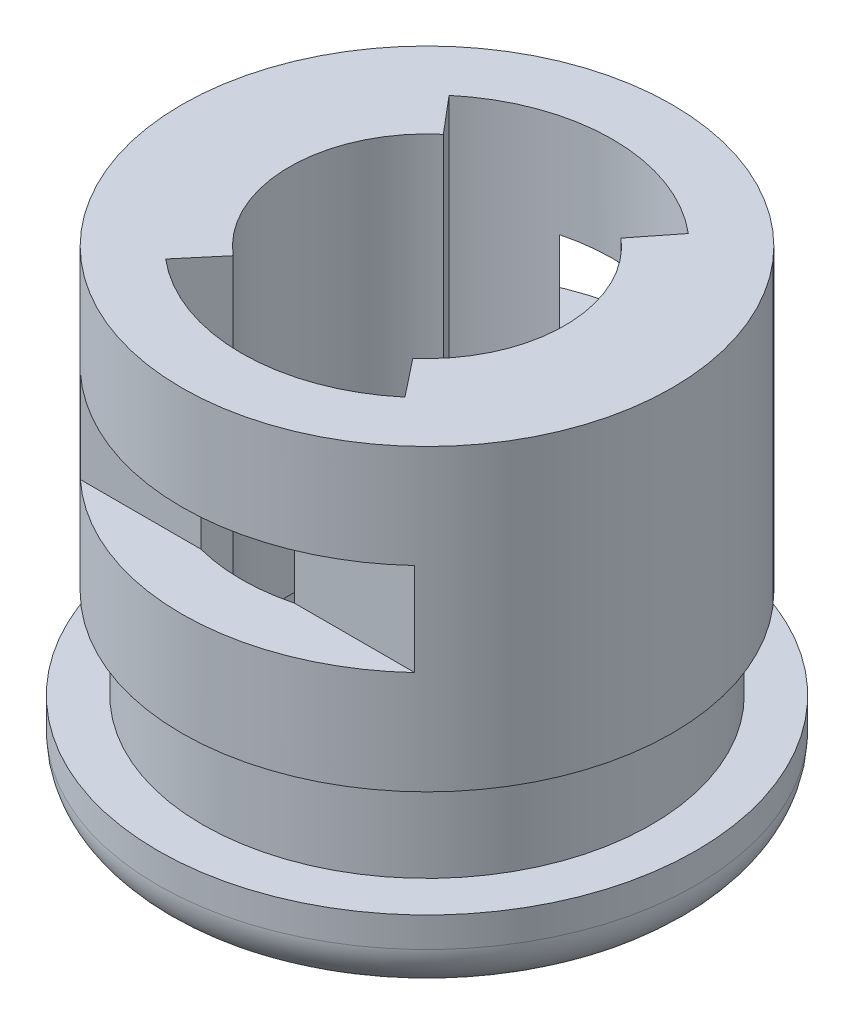
ISO-10303-21;
HEADER;
FILE_DESCRIPTION(('STEP AP214'),'2;1');
FILE_NAME('part.step','',(''),(''),'','','');
FILE_SCHEMA(('AUTOMOTIVE_DESIGN { 1 0 10303 214 1 1 1 1 }'));
ENDSEC;
DATA;
#1=APPLICATION_CONTEXT('core data for automotive mechanical design processes');
#2=APPLICATION_PROTOCOL_DEFINITION('international standard','automotive_design',2000,#1);
#3=PRODUCT_CONTEXT('',#1,'mechanical');
#4=PRODUCT('Part','Part','',(#3));
#5=PRODUCT_RELATED_PRODUCT_CATEGORY('part','',(#4));
#6=PRODUCT_DEFINITION_FORMATION('','',#4);
#7=PRODUCT_DEFINITION_CONTEXT('part definition',#1,'design');
#8=PRODUCT_DEFINITION('design','',#6,#7);
#9=PRODUCT_DEFINITION_SHAPE('','',#8);
#10=(LENGTH_UNIT() NAMED_UNIT(*) SI_UNIT(.MILLI.,.METRE.));
#11=(NAMED_UNIT(*) PLANE_ANGLE_UNIT() SI_UNIT($,.RADIAN.));
#12=(NAMED_UNIT(*) SI_UNIT($,.STERADIAN.) SOLID_ANGLE_UNIT());
#13=UNCERTAINTY_MEASURE_WITH_UNIT(LENGTH_MEASURE(1.E-05),#10,'distance_accuracy_value','');
#14=(GEOMETRIC_REPRESENTATION_CONTEXT(3) GLOBAL_UNCERTAINTY_ASSIGNED_CONTEXT((#13)) GLOBAL_UNIT_ASSIGNED_CONTEXT((#10,
#11,#12)) REPRESENTATION_CONTEXT('',''));
#15=CARTESIAN_POINT('',(0.,0.,0.));
#16=DIRECTION('',(0.,0.,1.));
#17=DIRECTION('',(1.,0.,0.));
#18=AXIS2_PLACEMENT_3D('',#15,#16,#17);
#19=CARTESIAN_POINT('',(0.,1.6,0.));
#20=DIRECTION('',(0.,1.,0.));
#21=DIRECTION('',(0.,0.,1.));
#22=AXIS2_PLACEMENT_3D('',#19,#20,#21);
#23=PLANE('',#22);
#24=CARTESIAN_POINT('',(0.,1.6,0.));
#25=DIRECTION('',(0.,1.,0.));
#26=DIRECTION('',(0.,0.,1.));
#27=AXIS2_PLACEMENT_3D('',#24,#25,#26);
#28=CIRCLE('',#27,2.3);
#29=CARTESIAN_POINT('',(1.64240677056568,1.6,1.61012421881046));
#30=VERTEX_POINT('',#29);
#31=CARTESIAN_POINT('',(1.64240677056568,1.6,-1.61012421881046));
#32=VERTEX_POINT('',#31);
#33=EDGE_CURVE('E452',#30,#32,#28,.T.);
#34=ORIENTED_EDGE('',*,*,#33,.T.);
#35=DIRECTION('',(0.,0.,1.));
#36=VECTOR('',#35,1.);
#37=CARTESIAN_POINT('',(1.64240677056568,1.6,-1.75));
#38=LINE('',#37,#36);
#39=EDGE_CURVE('E339',#32,#30,#38,.T.);
#40=ORIENTED_EDGE('',*,*,#39,.T.);
#41=EDGE_LOOP('',(#34,#40));
#42=FACE_BOUND('',#41,.T.);
#43=ADVANCED_FACE('F39',(#42),#23,.T.);
#44=CARTESIAN_POINT('',(0.,1.6,0.));
#45=DIRECTION('',(0.,1.,0.));
#46=DIRECTION('',(0.,0.,1.));
#47=AXIS2_PLACEMENT_3D('',#44,#45,#46);
#48=CIRCLE('',#47,2.4);
#49=CARTESIAN_POINT('',(1.56571861908372,1.6,-1.81893518462165));
#50=VERTEX_POINT('',#49);
#51=CARTESIAN_POINT('',(0.6,1.6,-2.32379000772445));
#52=VERTEX_POINT('',#51);
#53=EDGE_CURVE('E380',#50,#52,#48,.T.);
#54=ORIENTED_EDGE('',*,*,#53,.F.);
#55=DIRECTION('',(0.619978248543208,0.,-0.784618997560788));
#56=VECTOR('',#55,1.);
#57=CARTESIAN_POINT('',(2.,1.6,-2.3685438564654));
#58=LINE('',#57,#56);
#59=CARTESIAN_POINT('',(2.,1.6,-2.3685438564654));
#60=VERTEX_POINT('',#59);
#61=EDGE_CURVE('E451',#50,#60,#58,.T.);
#62=ORIENTED_EDGE('',*,*,#61,.T.);
#63=CARTESIAN_POINT('',(0.,1.6,0.));
#64=DIRECTION('',(0.,1.,0.));
#65=DIRECTION('',(0.,0.,1.));
#66=AXIS2_PLACEMENT_3D('',#63,#64,#65);
#67=CIRCLE('',#66,3.1);
#68=CARTESIAN_POINT('',(0.6,1.6,-3.04138126514911));
#69=VERTEX_POINT('',#68);
#70=EDGE_CURVE('E418',#60,#69,#67,.T.);
#71=ORIENTED_EDGE('',*,*,#70,.T.);
#72=DIRECTION('',(0.,0.,-1.));
#73=VECTOR('',#72,1.);
#74=CARTESIAN_POINT('',(0.6,1.6,-2.32379000772445));
#75=LINE('',#74,#73);
#76=EDGE_CURVE('E376',#52,#69,#75,.T.);
#77=ORIENTED_EDGE('',*,*,#76,.F.);
#78=EDGE_LOOP('',(#54,#62,#71,#77));
#79=FACE_BOUND('',#78,.T.);
#80=ADVANCED_FACE('F606',(#79),#23,.T.);
#81=DIRECTION('',(0.,0.,1.));
#82=VECTOR('',#81,1.);
#83=CARTESIAN_POINT('',(-0.6,1.6,-3.1));
#84=LINE('',#83,#82);
#85=CARTESIAN_POINT('',(-0.6,1.6,-3.04138126514911));
#86=VERTEX_POINT('',#85);
#87=CARTESIAN_POINT('',(-0.599999999999998,1.6,-2.32379000772445));
#88=VERTEX_POINT('',#87);
#89=EDGE_CURVE('E364',#86,#88,#84,.T.);
#90=ORIENTED_EDGE('',*,*,#89,.F.);
#91=CARTESIAN_POINT('',(-2.,1.6,-2.3685438564654));
#92=VERTEX_POINT('',#91);
#93=EDGE_CURVE('E424',#86,#92,#67,.T.);
#94=ORIENTED_EDGE('',*,*,#93,.T.);
#95=DIRECTION('',(0.645161290322581,0.,0.76404640531142));
#96=VECTOR('',#95,1.);
#97=CARTESIAN_POINT('',(-2.,1.6,-2.3685438564654));
#98=LINE('',#97,#96);
#99=CARTESIAN_POINT('',(-1.54838709677419,1.6,-1.83371137274741));
#100=VERTEX_POINT('',#99);
#101=EDGE_CURVE('E425',#92,#100,#98,.T.);
#102=ORIENTED_EDGE('',*,*,#101,.T.);
#103=CARTESIAN_POINT('',(0.,1.6,0.));
#104=DIRECTION('',(0.,1.,0.));
#105=DIRECTION('',(0.,0.,1.));
#106=AXIS2_PLACEMENT_3D('',#103,#104,#105);
#107=CIRCLE('',#106,2.4);
#108=EDGE_CURVE('E360',#88,#100,#107,.T.);
#109=ORIENTED_EDGE('',*,*,#108,.F.);
#110=EDGE_LOOP('',(#90,#94,#102,#109));
#111=FACE_BOUND('',#110,.T.);
#112=ADVANCED_FACE('F613',(#111),#23,.T.);
#113=CARTESIAN_POINT('',(-1.54838709677419,1.6,1.83371137274741));
#114=VERTEX_POINT('',#113);
#115=CARTESIAN_POINT('',(-0.599999999999999,1.6,2.32379000772445));
#116=VERTEX_POINT('',#115);
#117=EDGE_CURVE('E359',#114,#116,#107,.T.);
#118=ORIENTED_EDGE('',*,*,#117,.F.);
#119=DIRECTION('',(-0.645161290322581,0.,0.76404640531142));
#120=VECTOR('',#119,1.);
#121=CARTESIAN_POINT('',(-2.,1.6,2.3685438564654));
#122=LINE('',#121,#120);
#123=CARTESIAN_POINT('',(-2.,1.6,2.3685438564654));
#124=VERTEX_POINT('',#123);
#125=EDGE_CURVE('E432',#114,#124,#122,.T.);
#126=ORIENTED_EDGE('',*,*,#125,.T.);
#127=CARTESIAN_POINT('',(0.,1.6,0.));
#128=DIRECTION('',(0.,1.,0.));
#129=DIRECTION('',(0.,0.,1.));
#130=AXIS2_PLACEMENT_3D('',#127,#128,#129);
#131=CIRCLE('',#130,3.1);
#132=CARTESIAN_POINT('',(-0.599999999999998,1.6,3.04138126514911));
#133=VERTEX_POINT('',#132);
#134=EDGE_CURVE('E437',#124,#133,#131,.T.);
#135=ORIENTED_EDGE('',*,*,#134,.T.);
#136=DIRECTION('',(0.,0.,1.));
#137=VECTOR('',#136,1.);
#138=CARTESIAN_POINT('',(-0.599999999999998,1.6,2.32379000772445));
#139=LINE('',#138,#137);
#140=EDGE_CURVE('E355',#116,#133,#139,.T.);
#141=ORIENTED_EDGE('',*,*,#140,.F.);
#142=EDGE_LOOP('',(#118,#126,#135,#141));
#143=FACE_BOUND('',#142,.T.);
#144=ADVANCED_FACE('F622',(#143),#23,.T.);
#145=CARTESIAN_POINT('',(0.,0.,0.));
#146=DIRECTION('',(0.,1.,0.));
#147=DIRECTION('',(0.,0.,1.));
#148=AXIS2_PLACEMENT_3D('',#145,#146,#147);
#149=PLANE('',#148);
#150=CARTESIAN_POINT('',(0.,0.,0.));
#151=DIRECTION('',(0.,1.,0.));
#152=DIRECTION('',(0.,0.,1.));
#153=AXIS2_PLACEMENT_3D('',#150,#151,#152);
#154=CIRCLE('',#153,3.7);
#155=CARTESIAN_POINT('',(0.,0.,3.7));
#156=VERTEX_POINT('',#155);
#157=EDGE_CURVE('E263',#156,#156,#154,.F.);
#158=ORIENTED_EDGE('',*,*,#157,.T.);
#159=EDGE_LOOP('',(#158));
#160=FACE_BOUND('',#159,.T.);
#161=DIRECTION('',(0.,0.,1.));
#162=VECTOR('',#161,1.);
#163=CARTESIAN_POINT('',(1.64240677056568,0.,0.));
#164=LINE('',#163,#162);
#165=CARTESIAN_POINT('',(1.64240677056568,0.,-1.75));
#166=VERTEX_POINT('',#165);
#167=CARTESIAN_POINT('',(1.64240677056568,0.,1.75));
#168=VERTEX_POINT('',#167);
#169=EDGE_CURVE('E567',#166,#168,#164,.T.);
#170=ORIENTED_EDGE('',*,*,#169,.F.);
#171=CARTESIAN_POINT('',(0.,0.,0.));
#172=DIRECTION('',(0.,1.,0.));
#173=DIRECTION('',(0.,0.,1.));
#174=AXIS2_PLACEMENT_3D('',#171,#172,#173);
#175=CIRCLE('',#174,2.4);
#176=CARTESIAN_POINT('',(0.6,0.,-2.32379000772445));
#177=VERTEX_POINT('',#176);
#178=EDGE_CURVE('E528',#166,#177,#175,.T.);
#179=ORIENTED_EDGE('',*,*,#178,.T.);
#180=DIRECTION('',(0.,0.,-1.));
#181=VECTOR('',#180,1.);
#182=CARTESIAN_POINT('',(0.6,0.,0.));
#183=LINE('',#182,#181);
#184=CARTESIAN_POINT('',(0.6,0.,-3.1));
#185=VERTEX_POINT('',#184);
#186=EDGE_CURVE('E535',#177,#185,#183,.T.);
#187=ORIENTED_EDGE('',*,*,#186,.T.);
#188=DIRECTION('',(-1.,0.,0.));
#189=VECTOR('',#188,1.);
#190=CARTESIAN_POINT('',(0.,0.,-3.1));
#191=LINE('',#190,#189);
#192=CARTESIAN_POINT('',(-0.6,0.,-3.1));
#193=VERTEX_POINT('',#192);
#194=EDGE_CURVE('E539',#185,#193,#191,.T.);
#195=ORIENTED_EDGE('',*,*,#194,.T.);
#196=DIRECTION('',(0.,0.,1.));
#197=VECTOR('',#196,1.);
#198=CARTESIAN_POINT('',(-0.599999999999994,0.,0.));
#199=LINE('',#198,#197);
#200=CARTESIAN_POINT('',(-0.599999999999998,0.,-2.32379000772445));
#201=VERTEX_POINT('',#200);
#202=EDGE_CURVE('E543',#193,#201,#199,.T.);
#203=ORIENTED_EDGE('',*,*,#202,.T.);
#204=CARTESIAN_POINT('',(0.,0.,0.));
#205=DIRECTION('',(0.,1.,0.));
#206=DIRECTION('',(0.,0.,1.));
#207=AXIS2_PLACEMENT_3D('',#204,#205,#206);
#208=CIRCLE('',#207,2.4);
#209=CARTESIAN_POINT('',(-0.599999999999999,0.,2.32379000772445));
#210=VERTEX_POINT('',#209);
#211=EDGE_CURVE('E547',#201,#210,#208,.T.);
#212=ORIENTED_EDGE('',*,*,#211,.T.);
#213=DIRECTION('',(0.,0.,1.));
#214=VECTOR('',#213,1.);
#215=CARTESIAN_POINT('',(-0.6,0.,0.));
#216=LINE('',#215,#214);
#217=CARTESIAN_POINT('',(-0.599999999999998,0.,3.1));
#218=VERTEX_POINT('',#217);
#219=EDGE_CURVE('E551',#210,#218,#216,.T.);
#220=ORIENTED_EDGE('',*,*,#219,.T.);
#221=DIRECTION('',(1.,0.,0.));
#222=VECTOR('',#221,1.);
#223=CARTESIAN_POINT('',(0.,0.,3.1));
#224=LINE('',#223,#222);
#225=CARTESIAN_POINT('',(0.6,0.,3.1));
#226=VERTEX_POINT('',#225);
#227=EDGE_CURVE('E555',#218,#226,#224,.T.);
#228=ORIENTED_EDGE('',*,*,#227,.T.);
#229=DIRECTION('',(0.,0.,-1.));
#230=VECTOR('',#229,1.);
#231=CARTESIAN_POINT('',(0.6,0.,0.));
#232=LINE('',#231,#230);
#233=CARTESIAN_POINT('',(0.6,0.,2.32379000772445));
#234=VERTEX_POINT('',#233);
#235=EDGE_CURVE('E559',#226,#234,#232,.T.);
#236=ORIENTED_EDGE('',*,*,#235,.T.);
#237=CARTESIAN_POINT('',(0.,0.,0.));
#238=DIRECTION('',(0.,1.,0.));
#239=DIRECTION('',(0.,0.,1.));
#240=AXIS2_PLACEMENT_3D('',#237,#238,#239);
#241=CIRCLE('',#240,2.4);
#242=EDGE_CURVE('E563',#234,#168,#241,.T.);
#243=ORIENTED_EDGE('',*,*,#242,.T.);
#244=EDGE_LOOP('',(#170,#179,#187,#195,#203,#212,#220,#228,#236,#243));
#245=FACE_BOUND('',#244,.T.);
#246=ADVANCED_FACE('F578',(#160,#245),#149,.F.);
#247=CARTESIAN_POINT('',(0.,1.3,0.));
#248=DIRECTION('',(0.,-1.,0.));
#249=DIRECTION('',(0.,0.,-1.));
#250=AXIS2_PLACEMENT_3D('',#247,#248,#249);
#251=CYLINDRICAL_SURFACE('',#250,4.5);
#252=CARTESIAN_POINT('',(0.,0.8,0.));
#253=DIRECTION('',(0.,1.,0.));
#254=DIRECTION('',(0.,0.,1.));
#255=AXIS2_PLACEMENT_3D('',#252,#253,#254);
#256=CIRCLE('',#255,4.5);
#257=CARTESIAN_POINT('',(0.,0.8,4.5));
#258=VERTEX_POINT('',#257);
#259=EDGE_CURVE('E570',#258,#258,#256,.T.);
#260=ORIENTED_EDGE('',*,*,#259,.T.);
#261=EDGE_LOOP('',(#260));
#262=FACE_BOUND('',#261,.T.);
#263=CARTESIAN_POINT('',(0.,1.3,0.));
#264=DIRECTION('',(0.,1.,0.));
#265=DIRECTION('',(0.,0.,1.));
#266=AXIS2_PLACEMENT_3D('',#263,#264,#265);
#267=CIRCLE('',#266,4.5);
#268=CARTESIAN_POINT('',(0.,1.3,4.5));
#269=VERTEX_POINT('',#268);
#270=EDGE_CURVE('E523',#269,#269,#267,.T.);
#271=ORIENTED_EDGE('',*,*,#270,.F.);
#272=EDGE_LOOP('',(#271));
#273=FACE_BOUND('',#272,.T.);
#274=ADVANCED_FACE('F587',(#262,#273),#251,.T.);
#275=CARTESIAN_POINT('',(0.,1.3,0.));
#276=DIRECTION('',(0.,1.,0.));
#277=DIRECTION('',(0.,0.,1.));
#278=AXIS2_PLACEMENT_3D('',#275,#276,#277);
#279=PLANE('',#278);
#280=CARTESIAN_POINT('',(0.,1.3,0.));
#281=DIRECTION('',(0.,1.,0.));
#282=DIRECTION('',(0.,0.,1.));
#283=AXIS2_PLACEMENT_3D('',#280,#281,#282);
#284=CIRCLE('',#283,3.75);
#285=CARTESIAN_POINT('',(0.,1.3,3.75));
#286=VERTEX_POINT('',#285);
#287=EDGE_CURVE('E524',#286,#286,#284,.T.);
#288=ORIENTED_EDGE('',*,*,#287,.F.);
#289=EDGE_LOOP('',(#288));
#290=FACE_BOUND('',#289,.T.);
#291=ORIENTED_EDGE('',*,*,#270,.T.);
#292=EDGE_LOOP('',(#291));
#293=FACE_BOUND('',#292,.T.);
#294=ADVANCED_FACE('F590',(#290,#293),#279,.T.);
#295=CARTESIAN_POINT('',(0.,2.8,0.));
#296=DIRECTION('',(0.,-1.,0.));
#297=DIRECTION('',(0.,0.,-1.));
#298=AXIS2_PLACEMENT_3D('',#295,#296,#297);
#299=CYLINDRICAL_SURFACE('',#298,3.75);
#300=CARTESIAN_POINT('',(0.,2.8,0.));
#301=DIRECTION('',(0.,1.,0.));
#302=DIRECTION('',(0.,0.,1.));
#303=AXIS2_PLACEMENT_3D('',#300,#301,#302);
#304=CIRCLE('',#303,3.75);
#305=CARTESIAN_POINT('',(0.,2.8,3.75));
#306=VERTEX_POINT('',#305);
#307=EDGE_CURVE('E516',#306,#306,#304,.T.);
#308=ORIENTED_EDGE('',*,*,#307,.F.);
#309=EDGE_LOOP('',(#308));
#310=FACE_BOUND('',#309,.T.);
#311=ORIENTED_EDGE('',*,*,#287,.T.);
#312=EDGE_LOOP('',(#311));
#313=FACE_BOUND('',#312,.T.);
#314=ADVANCED_FACE('F594',(#310,#313),#299,.T.);
#315=CARTESIAN_POINT('',(0.,7.8,0.));
#316=DIRECTION('',(0.,-1.,0.));
#317=DIRECTION('',(0.,0.,-1.));
#318=AXIS2_PLACEMENT_3D('',#315,#316,#317);
#319=CYLINDRICAL_SURFACE('',#318,4.1);
#320=CARTESIAN_POINT('',(0.,6.075,0.));
#321=DIRECTION('',(0.,1.,0.));
#322=DIRECTION('',(0.,0.,1.));
#323=AXIS2_PLACEMENT_3D('',#320,#321,#322);
#324=CIRCLE('',#323,4.1);
#325=CARTESIAN_POINT('',(-2.79463772249642,6.075,3.));
#326=VERTEX_POINT('',#325);
#327=CARTESIAN_POINT('',(2.79463772249642,6.075,3.));
#328=VERTEX_POINT('',#327);
#329=EDGE_CURVE('E318',#326,#328,#324,.T.);
#330=ORIENTED_EDGE('',*,*,#329,.T.);
#331=DIRECTION('',(0.,-1.,0.));
#332=VECTOR('',#331,1.);
#333=CARTESIAN_POINT('',(2.79463772249642,7.8,3.));
#334=LINE('',#333,#332);
#335=CARTESIAN_POINT('',(2.79463772249643,4.525,3.));
#336=VERTEX_POINT('',#335);
#337=EDGE_CURVE('E315',#328,#336,#334,.T.);
#338=ORIENTED_EDGE('',*,*,#337,.T.);
#339=CARTESIAN_POINT('',(0.,4.525,0.));
#340=DIRECTION('',(0.,-1.,0.));
#341=DIRECTION('',(0.,0.,-1.));
#342=AXIS2_PLACEMENT_3D('',#339,#340,#341);
#343=CIRCLE('',#342,4.1);
#344=CARTESIAN_POINT('',(-2.79463772249643,4.525,3.));
#345=VERTEX_POINT('',#344);
#346=EDGE_CURVE('E55',#336,#345,#343,.T.);
#347=ORIENTED_EDGE('',*,*,#346,.T.);
#348=DIRECTION('',(0.,-1.,0.));
#349=VECTOR('',#348,1.);
#350=CARTESIAN_POINT('',(-2.79463772249642,7.8,3.));
#351=LINE('',#350,#349);
#352=EDGE_CURVE('E270',#345,#326,#351,.F.);
#353=ORIENTED_EDGE('',*,*,#352,.T.);
#354=EDGE_LOOP('',(#330,#338,#347,#353));
#355=FACE_BOUND('',#354,.T.);
#356=DIRECTION('',(0.,-1.,0.));
#357=VECTOR('',#356,1.);
#358=CARTESIAN_POINT('',(-2.79463772249643,7.8,-3.));
#359=LINE('',#358,#357);
#360=CARTESIAN_POINT('',(-2.79463772249643,6.075,-3.));
#361=VERTEX_POINT('',#360);
#362=CARTESIAN_POINT('',(-2.79463772249643,4.525,-3.));
#363=VERTEX_POINT('',#362);
#364=EDGE_CURVE('E324',#361,#363,#359,.T.);
#365=ORIENTED_EDGE('',*,*,#364,.T.);
#366=CARTESIAN_POINT('',(0.,4.525,0.));
#367=DIRECTION('',(0.,-1.,0.));
#368=DIRECTION('',(0.,0.,-1.));
#369=AXIS2_PLACEMENT_3D('',#366,#367,#368);
#370=CIRCLE('',#369,4.1);
#371=CARTESIAN_POINT('',(2.79463772249643,4.525,-3.));
#372=VERTEX_POINT('',#371);
#373=EDGE_CURVE('E328',#363,#372,#370,.T.);
#374=ORIENTED_EDGE('',*,*,#373,.T.);
#375=DIRECTION('',(0.,-1.,0.));
#376=VECTOR('',#375,1.);
#377=CARTESIAN_POINT('',(2.79463772249643,7.8,-3.));
#378=LINE('',#377,#376);
#379=CARTESIAN_POINT('',(2.79463772249643,6.075,-3.));
#380=VERTEX_POINT('',#379);
#381=EDGE_CURVE('E321',#372,#380,#378,.F.);
#382=ORIENTED_EDGE('',*,*,#381,.T.);
#383=CARTESIAN_POINT('',(0.,6.07500000000001,0.));
#384=DIRECTION('',(0.,1.,0.));
#385=DIRECTION('',(0.,0.,1.));
#386=AXIS2_PLACEMENT_3D('',#383,#384,#385);
#387=CIRCLE('',#386,4.1);
#388=EDGE_CURVE('E302',#380,#361,#387,.T.);
#389=ORIENTED_EDGE('',*,*,#388,.T.);
#390=EDGE_LOOP('',(#365,#374,#382,#389));
#391=FACE_BOUND('',#390,.T.);
#392=CARTESIAN_POINT('',(0.,7.8,0.));
#393=DIRECTION('',(0.,1.,0.));
#394=DIRECTION('',(0.,0.,1.));
#395=AXIS2_PLACEMENT_3D('',#392,#393,#394);
#396=CIRCLE('',#395,4.1);
#397=CARTESIAN_POINT('',(0.,7.8,4.1));
#398=VERTEX_POINT('',#397);
#399=EDGE_CURVE('E512',#398,#398,#396,.T.);
#400=ORIENTED_EDGE('',*,*,#399,.F.);
#401=EDGE_LOOP('',(#400));
#402=FACE_BOUND('',#401,.T.);
#403=CARTESIAN_POINT('',(0.,2.8,0.));
#404=DIRECTION('',(0.,1.,0.));
#405=DIRECTION('',(0.,0.,1.));
#406=AXIS2_PLACEMENT_3D('',#403,#404,#405);
#407=CIRCLE('',#406,4.1);
#408=CARTESIAN_POINT('',(0.,2.8,4.1));
#409=VERTEX_POINT('',#408);
#410=EDGE_CURVE('E490',#409,#409,#407,.T.);
#411=ORIENTED_EDGE('',*,*,#410,.T.);
#412=EDGE_LOOP('',(#411));
#413=FACE_BOUND('',#412,.T.);
#414=ADVANCED_FACE('F600',(#355,#391,#402,#413),#319,.T.);
#415=CARTESIAN_POINT('',(0.,7.8,0.));
#416=DIRECTION('',(0.,1.,0.));
#417=DIRECTION('',(0.,0.,1.));
#418=AXIS2_PLACEMENT_3D('',#415,#416,#417);
#419=PLANE('',#418);
#420=CARTESIAN_POINT('',(0.,7.8,0.));
#421=DIRECTION('',(0.,1.,0.));
#422=DIRECTION('',(0.,0.,1.));
#423=AXIS2_PLACEMENT_3D('',#420,#421,#422);
#424=CIRCLE('',#423,3.1);
#425=CARTESIAN_POINT('',(2.,7.8,-2.3685438564654));
#426=VERTEX_POINT('',#425);
#427=CARTESIAN_POINT('',(-2.,7.8,-2.3685438564654));
#428=VERTEX_POINT('',#427);
#429=EDGE_CURVE('E417',#426,#428,#424,.T.);
#430=ORIENTED_EDGE('',*,*,#429,.F.);
#431=DIRECTION('',(0.619978248543208,0.,-0.784618997560788));
#432=VECTOR('',#431,1.);
#433=CARTESIAN_POINT('',(2.,7.8,-2.3685438564654));
#434=LINE('',#433,#432);
#435=CARTESIAN_POINT('',(1.50366366443997,7.8,-1.74040098375143));
#436=VERTEX_POINT('',#435);
#437=EDGE_CURVE('E483',#436,#426,#434,.T.);
#438=ORIENTED_EDGE('',*,*,#437,.F.);
#439=CARTESIAN_POINT('',(0.,7.8,0.));
#440=DIRECTION('',(0.,1.,0.));
#441=DIRECTION('',(0.,0.,1.));
#442=AXIS2_PLACEMENT_3D('',#439,#440,#441);
#443=CIRCLE('',#442,2.3);
#444=CARTESIAN_POINT('',(1.50366366443997,7.8,1.74040098375143));
#445=VERTEX_POINT('',#444);
#446=EDGE_CURVE('E479',#445,#436,#443,.T.);
#447=ORIENTED_EDGE('',*,*,#446,.F.);
#448=DIRECTION('',(-0.619978248543208,0.,-0.784618997560788));
#449=VECTOR('',#448,1.);
#450=CARTESIAN_POINT('',(2.,7.8,2.3685438564654));
#451=LINE('',#450,#449);
#452=CARTESIAN_POINT('',(2.,7.8,2.3685438564654));
#453=VERTEX_POINT('',#452);
#454=EDGE_CURVE('E475',#453,#445,#451,.T.);
#455=ORIENTED_EDGE('',*,*,#454,.F.);
#456=CARTESIAN_POINT('',(0.,7.8,0.));
#457=DIRECTION('',(0.,1.,0.));
#458=DIRECTION('',(0.,0.,1.));
#459=AXIS2_PLACEMENT_3D('',#456,#457,#458);
#460=CIRCLE('',#459,3.1);
#461=CARTESIAN_POINT('',(-2.,7.8,2.3685438564654));
#462=VERTEX_POINT('',#461);
#463=EDGE_CURVE('E471',#462,#453,#460,.T.);
#464=ORIENTED_EDGE('',*,*,#463,.F.);
#465=DIRECTION('',(-0.645161290322581,0.,0.76404640531142));
#466=VECTOR('',#465,1.);
#467=CARTESIAN_POINT('',(-2.,7.8,2.3685438564654));
#468=LINE('',#467,#466);
#469=CARTESIAN_POINT('',(-1.48387096774194,7.8,1.75730673221627));
#470=VERTEX_POINT('',#469);
#471=EDGE_CURVE('E467',#470,#462,#468,.T.);
#472=ORIENTED_EDGE('',*,*,#471,.F.);
#473=CARTESIAN_POINT('',(0.,7.8,0.));
#474=DIRECTION('',(0.,1.,0.));
#475=DIRECTION('',(0.,0.,1.));
#476=AXIS2_PLACEMENT_3D('',#473,#474,#475);
#477=CIRCLE('',#476,2.3);
#478=CARTESIAN_POINT('',(-1.48387096774193,7.8,-1.75730673221627));
#479=VERTEX_POINT('',#478);
#480=EDGE_CURVE('E463',#479,#470,#477,.T.);
#481=ORIENTED_EDGE('',*,*,#480,.F.);
#482=DIRECTION('',(0.645161290322581,0.,0.76404640531142));
#483=VECTOR('',#482,1.);
#484=CARTESIAN_POINT('',(-2.,7.8,-2.3685438564654));
#485=LINE('',#484,#483);
#486=EDGE_CURVE('E459',#428,#479,#485,.T.);
#487=ORIENTED_EDGE('',*,*,#486,.F.);
#488=EDGE_LOOP('',(#430,#438,#447,#455,#464,#472,#481,#487));
#489=FACE_BOUND('',#488,.T.);
#490=ORIENTED_EDGE('',*,*,#399,.T.);
#491=EDGE_LOOP('',(#490));
#492=FACE_BOUND('',#491,.T.);
#493=ADVANCED_FACE('F786',(#489,#492),#419,.T.);
#494=CARTESIAN_POINT('',(0.,2.8,0.));
#495=DIRECTION('',(0.,1.,0.));
#496=DIRECTION('',(0.,0.,1.));
#497=AXIS2_PLACEMENT_3D('',#494,#495,#496);
#498=PLANE('',#497);
#499=ORIENTED_EDGE('',*,*,#307,.T.);
#500=EDGE_LOOP('',(#499));
#501=FACE_BOUND('',#500,.T.);
#502=ORIENTED_EDGE('',*,*,#410,.F.);
#503=EDGE_LOOP('',(#502));
#504=FACE_BOUND('',#503,.T.);
#505=ADVANCED_FACE('F844',(#501,#504),#498,.F.);
#506=CARTESIAN_POINT('',(0.,1.6,0.));
#507=DIRECTION('',(0.,1.,0.));
#508=DIRECTION('',(0.,0.,1.));
#509=AXIS2_PLACEMENT_3D('',#506,#507,#508);
#510=CYLINDRICAL_SURFACE('',#509,3.1);
#511=CARTESIAN_POINT('',(0.,6.07500000000001,0.));
#512=DIRECTION('',(0.,1.,0.));
#513=DIRECTION('',(0.,0.,1.));
#514=AXIS2_PLACEMENT_3D('',#511,#512,#513);
#515=CIRCLE('',#514,3.1);
#516=CARTESIAN_POINT('',(-0.781024967590664,6.075,-3.));
#517=VERTEX_POINT('',#516);
#518=CARTESIAN_POINT('',(0.781024967590664,6.075,-3.));
#519=VERTEX_POINT('',#518);
#520=EDGE_CURVE('E48',#517,#519,#515,.F.);
#521=ORIENTED_EDGE('',*,*,#520,.T.);
#522=DIRECTION('',(0.,1.,0.));
#523=VECTOR('',#522,1.);
#524=CARTESIAN_POINT('',(0.781024967590664,1.6,-3.));
#525=LINE('',#524,#523);
#526=CARTESIAN_POINT('',(0.781024967590664,4.525,-3.));
#527=VERTEX_POINT('',#526);
#528=EDGE_CURVE('E11',#519,#527,#525,.F.);
#529=ORIENTED_EDGE('',*,*,#528,.T.);
#530=CARTESIAN_POINT('',(0.,4.525,0.));
#531=DIRECTION('',(0.,-1.,0.));
#532=DIRECTION('',(0.,0.,-1.));
#533=AXIS2_PLACEMENT_3D('',#530,#531,#532);
#534=CIRCLE('',#533,3.1);
#535=CARTESIAN_POINT('',(-0.781024967590664,4.525,-3.));
#536=VERTEX_POINT('',#535);
#537=EDGE_CURVE('E289',#527,#536,#534,.F.);
#538=ORIENTED_EDGE('',*,*,#537,.T.);
#539=DIRECTION('',(0.,1.,0.));
#540=VECTOR('',#539,1.);
#541=CARTESIAN_POINT('',(-0.781024967590664,1.6,-3.));
#542=LINE('',#541,#540);
#543=EDGE_CURVE('E282',#536,#517,#542,.T.);
#544=ORIENTED_EDGE('',*,*,#543,.T.);
#545=EDGE_LOOP('',(#521,#529,#538,#544));
#546=FACE_BOUND('',#545,.T.);
#547=ORIENTED_EDGE('',*,*,#429,.T.);
#548=DIRECTION('',(0.,1.,0.));
#549=VECTOR('',#548,1.);
#550=CARTESIAN_POINT('',(-2.,1.6,-2.3685438564654));
#551=LINE('',#550,#549);
#552=EDGE_CURVE('E456',#92,#428,#551,.T.);
#553=ORIENTED_EDGE('',*,*,#552,.F.);
#554=ORIENTED_EDGE('',*,*,#93,.F.);
#555=CARTESIAN_POINT('',(0.,1.6,-3.1));
#556=VERTEX_POINT('',#555);
#557=EDGE_CURVE('E659',#556,#86,#67,.T.);
#558=ORIENTED_EDGE('',*,*,#557,.F.);
#559=EDGE_CURVE('E423',#69,#556,#67,.T.);
#560=ORIENTED_EDGE('',*,*,#559,.F.);
#561=ORIENTED_EDGE('',*,*,#70,.F.);
#562=DIRECTION('',(0.,1.,0.));
#563=VECTOR('',#562,1.);
#564=CARTESIAN_POINT('',(2.,1.6,-2.3685438564654));
#565=LINE('',#564,#563);
#566=EDGE_CURVE('E487',#60,#426,#565,.T.);
#567=ORIENTED_EDGE('',*,*,#566,.T.);
#568=EDGE_LOOP('',(#547,#553,#554,#558,#560,#561,#567));
#569=FACE_BOUND('',#568,.T.);
#570=ADVANCED_FACE('F296',(#546,#569),#510,.F.);
#571=CARTESIAN_POINT('',(2.,1.6,-2.3685438564654));
#572=DIRECTION('',(0.784618997560788,0.,0.619978248543208));
#573=DIRECTION('',(0.619978248543208,0.,-0.784618997560788));
#574=AXIS2_PLACEMENT_3D('',#571,#572,#573);
#575=PLANE('',#574);
#576=ORIENTED_EDGE('',*,*,#437,.T.);
#577=ORIENTED_EDGE('',*,*,#566,.F.);
#578=ORIENTED_EDGE('',*,*,#61,.F.);
#579=CARTESIAN_POINT('',(1.50366366443997,1.6,-1.74040098375143));
#580=VERTEX_POINT('',#579);
#581=EDGE_CURVE('E453',#580,#50,#58,.T.);
#582=ORIENTED_EDGE('',*,*,#581,.F.);
#583=DIRECTION('',(0.,1.,0.));
#584=VECTOR('',#583,1.);
#585=CARTESIAN_POINT('',(1.50366366443997,1.6,-1.74040098375143));
#586=LINE('',#585,#584);
#587=EDGE_CURVE('E491',#580,#436,#586,.T.);
#588=ORIENTED_EDGE('',*,*,#587,.T.);
#589=EDGE_LOOP('',(#576,#577,#578,#582,#588));
#590=FACE_BOUND('',#589,.T.);
#591=ADVANCED_FACE('F806',(#590),#575,.F.);
#592=CARTESIAN_POINT('',(0.,1.6,0.));
#593=DIRECTION('',(0.,1.,0.));
#594=DIRECTION('',(0.,0.,1.));
#595=AXIS2_PLACEMENT_3D('',#592,#593,#594);
#596=CYLINDRICAL_SURFACE('',#595,2.3);
#597=ORIENTED_EDGE('',*,*,#446,.T.);
#598=ORIENTED_EDGE('',*,*,#587,.F.);
#599=EDGE_CURVE('E447',#32,#580,#28,.T.);
#600=ORIENTED_EDGE('',*,*,#599,.F.);
#601=ORIENTED_EDGE('',*,*,#33,.F.);
#602=CARTESIAN_POINT('',(1.50366366443997,1.6,1.74040098375143));
#603=VERTEX_POINT('',#602);
#604=EDGE_CURVE('E448',#603,#30,#28,.T.);
#605=ORIENTED_EDGE('',*,*,#604,.F.);
#606=DIRECTION('',(0.,1.,0.));
#607=VECTOR('',#606,1.);
#608=CARTESIAN_POINT('',(1.50366366443997,1.6,1.74040098375143));
#609=LINE('',#608,#607);
#610=EDGE_CURVE('E494',#603,#445,#609,.T.);
#611=ORIENTED_EDGE('',*,*,#610,.T.);
#612=EDGE_LOOP('',(#597,#598,#600,#601,#605,#611));
#613=FACE_BOUND('',#612,.T.);
#614=ADVANCED_FACE('F821',(#613),#596,.F.);
#615=CARTESIAN_POINT('',(2.,1.6,2.3685438564654));
#616=DIRECTION('',(0.784618997560788,0.,-0.619978248543208));
#617=DIRECTION('',(-0.619978248543208,0.,-0.784618997560788));
#618=AXIS2_PLACEMENT_3D('',#615,#616,#617);
#619=PLANE('',#618);
#620=ORIENTED_EDGE('',*,*,#454,.T.);
#621=ORIENTED_EDGE('',*,*,#610,.F.);
#622=DIRECTION('',(-0.619978248543208,0.,-0.784618997560788));
#623=VECTOR('',#622,1.);
#624=CARTESIAN_POINT('',(2.,1.6,2.3685438564654));
#625=LINE('',#624,#623);
#626=CARTESIAN_POINT('',(1.56571861908372,1.6,1.81893518462165));
#627=VERTEX_POINT('',#626);
#628=EDGE_CURVE('E441',#627,#603,#625,.T.);
#629=ORIENTED_EDGE('',*,*,#628,.F.);
#630=CARTESIAN_POINT('',(2.,1.6,2.3685438564654));
#631=VERTEX_POINT('',#630);
#632=EDGE_CURVE('E443',#631,#627,#625,.T.);
#633=ORIENTED_EDGE('',*,*,#632,.F.);
#634=DIRECTION('',(0.,1.,0.));
#635=VECTOR('',#634,1.);
#636=CARTESIAN_POINT('',(2.,1.6,2.3685438564654));
#637=LINE('',#636,#635);
#638=EDGE_CURVE('E497',#631,#453,#637,.T.);
#639=ORIENTED_EDGE('',*,*,#638,.T.);
#640=EDGE_LOOP('',(#620,#621,#629,#633,#639));
#641=FACE_BOUND('',#640,.T.);
#642=ADVANCED_FACE('F792',(#641),#619,.F.);
#643=CARTESIAN_POINT('',(0.,1.6,0.));
#644=DIRECTION('',(0.,1.,0.));
#645=DIRECTION('',(0.,0.,1.));
#646=AXIS2_PLACEMENT_3D('',#643,#644,#645);
#647=CYLINDRICAL_SURFACE('',#646,3.1);
#648=DIRECTION('',(0.,1.,0.));
#649=VECTOR('',#648,1.);
#650=CARTESIAN_POINT('',(0.781024967590671,1.6,3.));
#651=LINE('',#650,#649);
#652=CARTESIAN_POINT('',(0.781024967590668,4.525,3.));
#653=VERTEX_POINT('',#652);
#654=CARTESIAN_POINT('',(0.781024967590672,6.075,3.));
#655=VERTEX_POINT('',#654);
#656=EDGE_CURVE('E262',#653,#655,#651,.T.);
#657=ORIENTED_EDGE('',*,*,#656,.T.);
#658=CARTESIAN_POINT('',(0.,6.075,0.));
#659=DIRECTION('',(0.,1.,0.));
#660=DIRECTION('',(0.,0.,1.));
#661=AXIS2_PLACEMENT_3D('',#658,#659,#660);
#662=CIRCLE('',#661,3.1);
#663=CARTESIAN_POINT('',(-0.781024967590672,6.075,3.));
#664=VERTEX_POINT('',#663);
#665=EDGE_CURVE('E277',#655,#664,#662,.F.);
#666=ORIENTED_EDGE('',*,*,#665,.T.);
#667=DIRECTION('',(0.,1.,0.));
#668=VECTOR('',#667,1.);
#669=CARTESIAN_POINT('',(-0.781024967590671,1.6,3.));
#670=LINE('',#669,#668);
#671=CARTESIAN_POINT('',(-0.781024967590668,4.525,3.));
#672=VERTEX_POINT('',#671);
#673=EDGE_CURVE('E268',#664,#672,#670,.F.);
#674=ORIENTED_EDGE('',*,*,#673,.T.);
#675=CARTESIAN_POINT('',(0.,4.525,0.));
#676=DIRECTION('',(0.,-1.,0.));
#677=DIRECTION('',(0.,0.,-1.));
#678=AXIS2_PLACEMENT_3D('',#675,#676,#677);
#679=CIRCLE('',#678,3.1);
#680=EDGE_CURVE('E250',#672,#653,#679,.F.);
#681=ORIENTED_EDGE('',*,*,#680,.T.);
#682=EDGE_LOOP('',(#657,#666,#674,#681));
#683=FACE_BOUND('',#682,.T.);
#684=ORIENTED_EDGE('',*,*,#463,.T.);
#685=ORIENTED_EDGE('',*,*,#638,.F.);
#686=CARTESIAN_POINT('',(0.6,1.6,3.04138126514911));
#687=VERTEX_POINT('',#686);
#688=EDGE_CURVE('E436',#687,#631,#131,.T.);
#689=ORIENTED_EDGE('',*,*,#688,.F.);
#690=CARTESIAN_POINT('',(0.,1.6,3.1));
#691=VERTEX_POINT('',#690);
#692=EDGE_CURVE('E769',#691,#687,#131,.T.);
#693=ORIENTED_EDGE('',*,*,#692,.F.);
#694=EDGE_CURVE('E442',#133,#691,#131,.T.);
#695=ORIENTED_EDGE('',*,*,#694,.F.);
#696=ORIENTED_EDGE('',*,*,#134,.F.);
#697=DIRECTION('',(0.,1.,0.));
#698=VECTOR('',#697,1.);
#699=CARTESIAN_POINT('',(-2.,1.6,2.3685438564654));
#700=LINE('',#699,#698);
#701=EDGE_CURVE('E500',#124,#462,#700,.T.);
#702=ORIENTED_EDGE('',*,*,#701,.T.);
#703=EDGE_LOOP('',(#684,#685,#689,#693,#695,#696,#702));
#704=FACE_BOUND('',#703,.T.);
#705=ADVANCED_FACE('F275',(#683,#704),#647,.F.);
#706=CARTESIAN_POINT('',(-2.,1.6,2.3685438564654));
#707=DIRECTION('',(-0.76404640531142,0.,-0.645161290322581));
#708=DIRECTION('',(-0.645161290322581,0.,0.76404640531142));
#709=AXIS2_PLACEMENT_3D('',#706,#707,#708);
#710=PLANE('',#709);
#711=ORIENTED_EDGE('',*,*,#471,.T.);
#712=ORIENTED_EDGE('',*,*,#701,.F.);
#713=ORIENTED_EDGE('',*,*,#125,.F.);
#714=CARTESIAN_POINT('',(-1.48387096774194,1.6,1.75730673221627));
#715=VERTEX_POINT('',#714);
#716=EDGE_CURVE('E433',#715,#114,#122,.T.);
#717=ORIENTED_EDGE('',*,*,#716,.F.);
#718=DIRECTION('',(0.,1.,0.));
#719=VECTOR('',#718,1.);
#720=CARTESIAN_POINT('',(-1.48387096774194,1.6,1.75730673221627));
#721=LINE('',#720,#719);
#722=EDGE_CURVE('E503',#715,#470,#721,.T.);
#723=ORIENTED_EDGE('',*,*,#722,.T.);
#724=EDGE_LOOP('',(#711,#712,#713,#717,#723));
#725=FACE_BOUND('',#724,.T.);
#726=ADVANCED_FACE('F652',(#725),#710,.F.);
#727=CARTESIAN_POINT('',(0.,1.6,0.));
#728=DIRECTION('',(0.,1.,0.));
#729=DIRECTION('',(0.,0.,1.));
#730=AXIS2_PLACEMENT_3D('',#727,#728,#729);
#731=CYLINDRICAL_SURFACE('',#730,2.3);
#732=ORIENTED_EDGE('',*,*,#480,.T.);
#733=ORIENTED_EDGE('',*,*,#722,.F.);
#734=CARTESIAN_POINT('',(0.,1.6,0.));
#735=DIRECTION('',(0.,1.,0.));
#736=DIRECTION('',(0.,0.,1.));
#737=AXIS2_PLACEMENT_3D('',#734,#735,#736);
#738=CIRCLE('',#737,2.3);
#739=CARTESIAN_POINT('',(-1.48387096774193,1.6,-1.75730673221627));
#740=VERTEX_POINT('',#739);
#741=EDGE_CURVE('E429',#740,#715,#738,.T.);
#742=ORIENTED_EDGE('',*,*,#741,.F.);
#743=DIRECTION('',(0.,1.,0.));
#744=VECTOR('',#743,1.);
#745=CARTESIAN_POINT('',(-1.48387096774193,1.6,-1.75730673221627));
#746=LINE('',#745,#744);
#747=EDGE_CURVE('E506',#740,#479,#746,.T.);
#748=ORIENTED_EDGE('',*,*,#747,.T.);
#749=EDGE_LOOP('',(#732,#733,#742,#748));
#750=FACE_BOUND('',#749,.T.);
#751=ADVANCED_FACE('F630',(#750),#731,.F.);
#752=CARTESIAN_POINT('',(-2.,1.6,-2.3685438564654));
#753=DIRECTION('',(-0.76404640531142,0.,0.645161290322581));
#754=DIRECTION('',(0.645161290322581,0.,0.76404640531142));
#755=AXIS2_PLACEMENT_3D('',#752,#753,#754);
#756=PLANE('',#755);
#757=ORIENTED_EDGE('',*,*,#486,.T.);
#758=ORIENTED_EDGE('',*,*,#747,.F.);
#759=EDGE_CURVE('E422',#100,#740,#98,.T.);
#760=ORIENTED_EDGE('',*,*,#759,.F.);
#761=ORIENTED_EDGE('',*,*,#101,.F.);
#762=ORIENTED_EDGE('',*,*,#552,.T.);
#763=EDGE_LOOP('',(#757,#758,#760,#761,#762));
#764=FACE_BOUND('',#763,.T.);
#765=ADVANCED_FACE('F620',(#764),#756,.F.);
#766=DIRECTION('',(0.,0.,-1.));
#767=VECTOR('',#766,1.);
#768=CARTESIAN_POINT('',(0.6,1.6,3.1));
#769=LINE('',#768,#767);
#770=CARTESIAN_POINT('',(0.6,1.6,2.32379000772445));
#771=VERTEX_POINT('',#770);
#772=EDGE_CURVE('E344',#687,#771,#769,.T.);
#773=ORIENTED_EDGE('',*,*,#772,.F.);
#774=ORIENTED_EDGE('',*,*,#688,.T.);
#775=ORIENTED_EDGE('',*,*,#632,.T.);
#776=CARTESIAN_POINT('',(0.,1.6,0.));
#777=DIRECTION('',(0.,1.,0.));
#778=DIRECTION('',(0.,0.,1.));
#779=AXIS2_PLACEMENT_3D('',#776,#777,#778);
#780=CIRCLE('',#779,2.4);
#781=EDGE_CURVE('E340',#771,#627,#780,.T.);
#782=ORIENTED_EDGE('',*,*,#781,.F.);
#783=EDGE_LOOP('',(#773,#774,#775,#782));
#784=FACE_BOUND('',#783,.T.);
#785=ADVANCED_FACE('F609',(#784),#23,.T.);
#786=CARTESIAN_POINT('',(0.,1.6,0.));
#787=DIRECTION('',(0.,1.,0.));
#788=DIRECTION('',(0.,0.,1.));
#789=AXIS2_PLACEMENT_3D('',#786,#787,#788);
#790=PLANE('',#789);
#791=ORIENTED_EDGE('',*,*,#559,.T.);
#792=DIRECTION('',(-1.,0.,0.));
#793=VECTOR('',#792,1.);
#794=CARTESIAN_POINT('',(0.6,1.6,-3.1));
#795=LINE('',#794,#793);
#796=CARTESIAN_POINT('',(0.6,1.6,-3.1));
#797=VERTEX_POINT('',#796);
#798=EDGE_CURVE('E371',#797,#556,#795,.T.);
#799=ORIENTED_EDGE('',*,*,#798,.F.);
#800=EDGE_CURVE('E375',#69,#797,#75,.T.);
#801=ORIENTED_EDGE('',*,*,#800,.F.);
#802=EDGE_LOOP('',(#791,#799,#801));
#803=FACE_BOUND('',#802,.T.);
#804=ADVANCED_FACE('F619',(#803),#790,.F.);
#805=ORIENTED_EDGE('',*,*,#557,.T.);
#806=CARTESIAN_POINT('',(-0.6,1.6,-3.1));
#807=VERTEX_POINT('',#806);
#808=EDGE_CURVE('E366',#807,#86,#84,.T.);
#809=ORIENTED_EDGE('',*,*,#808,.F.);
#810=EDGE_CURVE('E370',#556,#807,#795,.T.);
#811=ORIENTED_EDGE('',*,*,#810,.F.);
#812=EDGE_LOOP('',(#805,#809,#811));
#813=FACE_BOUND('',#812,.T.);
#814=ADVANCED_FACE('F627',(#813),#790,.F.);
#815=ORIENTED_EDGE('',*,*,#759,.T.);
#816=ORIENTED_EDGE('',*,*,#741,.T.);
#817=ORIENTED_EDGE('',*,*,#716,.T.);
#818=EDGE_CURVE('E365',#100,#114,#107,.T.);
#819=ORIENTED_EDGE('',*,*,#818,.F.);
#820=EDGE_LOOP('',(#815,#816,#817,#819));
#821=FACE_BOUND('',#820,.T.);
#822=ADVANCED_FACE('F831',(#821),#790,.F.);
#823=ORIENTED_EDGE('',*,*,#694,.T.);
#824=DIRECTION('',(1.,0.,0.));
#825=VECTOR('',#824,1.);
#826=CARTESIAN_POINT('',(-0.599999999999998,1.6,3.1));
#827=LINE('',#826,#825);
#828=CARTESIAN_POINT('',(-0.599999999999998,1.6,3.1));
#829=VERTEX_POINT('',#828);
#830=EDGE_CURVE('E350',#829,#691,#827,.T.);
#831=ORIENTED_EDGE('',*,*,#830,.F.);
#832=EDGE_CURVE('E354',#133,#829,#139,.T.);
#833=ORIENTED_EDGE('',*,*,#832,.F.);
#834=EDGE_LOOP('',(#823,#831,#833));
#835=FACE_BOUND('',#834,.T.);
#836=ADVANCED_FACE('F778',(#835),#790,.F.);
#837=ORIENTED_EDGE('',*,*,#692,.T.);
#838=CARTESIAN_POINT('',(0.6,1.6,3.1));
#839=VERTEX_POINT('',#838);
#840=EDGE_CURVE('E345',#839,#687,#769,.T.);
#841=ORIENTED_EDGE('',*,*,#840,.F.);
#842=EDGE_CURVE('E349',#691,#839,#827,.T.);
#843=ORIENTED_EDGE('',*,*,#842,.F.);
#844=EDGE_LOOP('',(#837,#841,#843));
#845=FACE_BOUND('',#844,.T.);
#846=ADVANCED_FACE('F754',(#845),#790,.F.);
#847=ORIENTED_EDGE('',*,*,#628,.T.);
#848=ORIENTED_EDGE('',*,*,#604,.T.);
#849=CARTESIAN_POINT('',(1.64240677056568,1.6,1.75));
#850=VERTEX_POINT('',#849);
#851=EDGE_CURVE('E333',#30,#850,#38,.T.);
#852=ORIENTED_EDGE('',*,*,#851,.T.);
#853=EDGE_CURVE('E338',#627,#850,#780,.T.);
#854=ORIENTED_EDGE('',*,*,#853,.F.);
#855=EDGE_LOOP('',(#847,#848,#852,#854));
#856=FACE_BOUND('',#855,.T.);
#857=ADVANCED_FACE('F714',(#856),#790,.F.);
#858=CARTESIAN_POINT('',(1.64240677056568,-0.2,-1.75));
#859=DIRECTION('',(-1.,0.,0.));
#860=DIRECTION('',(0.,0.,1.));
#861=AXIS2_PLACEMENT_3D('',#858,#859,#860);
#862=PLANE('',#861);
#863=ORIENTED_EDGE('',*,*,#169,.T.);
#864=DIRECTION('',(0.,1.,0.));
#865=VECTOR('',#864,1.);
#866=CARTESIAN_POINT('',(1.64240677056568,-0.2,1.75));
#867=LINE('',#866,#865);
#868=EDGE_CURVE('E413',#168,#850,#867,.T.);
#869=ORIENTED_EDGE('',*,*,#868,.T.);
#870=ORIENTED_EDGE('',*,*,#851,.F.);
#871=ORIENTED_EDGE('',*,*,#39,.F.);
#872=CARTESIAN_POINT('',(1.64240677056568,1.6,-1.75));
#873=VERTEX_POINT('',#872);
#874=EDGE_CURVE('E334',#873,#32,#38,.T.);
#875=ORIENTED_EDGE('',*,*,#874,.F.);
#876=DIRECTION('',(0.,1.,0.));
#877=VECTOR('',#876,1.);
#878=CARTESIAN_POINT('',(1.64240677056568,-0.2,-1.75));
#879=LINE('',#878,#877);
#880=EDGE_CURVE('E385',#166,#873,#879,.T.);
#881=ORIENTED_EDGE('',*,*,#880,.F.);
#882=EDGE_LOOP('',(#863,#869,#870,#871,#875,#881));
#883=FACE_BOUND('',#882,.T.);
#884=ADVANCED_FACE('F747',(#883),#862,.T.);
#885=CARTESIAN_POINT('',(0.,-0.2,0.));
#886=DIRECTION('',(0.,1.,0.));
#887=DIRECTION('',(0.,0.,1.));
#888=AXIS2_PLACEMENT_3D('',#885,#886,#887);
#889=CYLINDRICAL_SURFACE('',#888,2.4);
#890=DIRECTION('',(0.,1.,0.));
#891=VECTOR('',#890,1.);
#892=CARTESIAN_POINT('',(0.6,-0.2,2.32379000772445));
#893=LINE('',#892,#891);
#894=EDGE_CURVE('E409',#234,#771,#893,.T.);
#895=ORIENTED_EDGE('',*,*,#894,.T.);
#896=ORIENTED_EDGE('',*,*,#781,.T.);
#897=ORIENTED_EDGE('',*,*,#853,.T.);
#898=ORIENTED_EDGE('',*,*,#868,.F.);
#899=ORIENTED_EDGE('',*,*,#242,.F.);
#900=EDGE_LOOP('',(#895,#896,#897,#898,#899));
#901=FACE_BOUND('',#900,.T.);
#902=ADVANCED_FACE('F744',(#901),#889,.F.);
#903=CARTESIAN_POINT('',(0.6,-0.2,3.1));
#904=DIRECTION('',(1.,0.,0.));
#905=DIRECTION('',(0.,0.,-1.));
#906=AXIS2_PLACEMENT_3D('',#903,#904,#905);
#907=PLANE('',#906);
#908=DIRECTION('',(0.,1.,0.));
#909=VECTOR('',#908,1.);
#910=CARTESIAN_POINT('',(0.6,-0.2,3.1));
#911=LINE('',#910,#909);
#912=EDGE_CURVE('E406',#226,#839,#911,.T.);
#913=ORIENTED_EDGE('',*,*,#912,.T.);
#914=ORIENTED_EDGE('',*,*,#840,.T.);
#915=ORIENTED_EDGE('',*,*,#772,.T.);
#916=ORIENTED_EDGE('',*,*,#894,.F.);
#917=ORIENTED_EDGE('',*,*,#235,.F.);
#918=EDGE_LOOP('',(#913,#914,#915,#916,#917));
#919=FACE_BOUND('',#918,.T.);
#920=ADVANCED_FACE('F740',(#919),#907,.F.);
#921=CARTESIAN_POINT('',(-0.599999999999998,-0.2,3.1));
#922=DIRECTION('',(0.,0.,1.));
#923=DIRECTION('',(1.,0.,0.));
#924=AXIS2_PLACEMENT_3D('',#921,#922,#923);
#925=PLANE('',#924);
#926=DIRECTION('',(0.,1.,0.));
#927=VECTOR('',#926,1.);
#928=CARTESIAN_POINT('',(-0.599999999999998,-0.2,3.1));
#929=LINE('',#928,#927);
#930=EDGE_CURVE('E403',#218,#829,#929,.T.);
#931=ORIENTED_EDGE('',*,*,#930,.T.);
#932=ORIENTED_EDGE('',*,*,#830,.T.);
#933=ORIENTED_EDGE('',*,*,#842,.T.);
#934=ORIENTED_EDGE('',*,*,#912,.F.);
#935=ORIENTED_EDGE('',*,*,#227,.F.);
#936=EDGE_LOOP('',(#931,#932,#933,#934,#935));
#937=FACE_BOUND('',#936,.T.);
#938=ADVANCED_FACE('F736',(#937),#925,.F.);
#939=CARTESIAN_POINT('',(-0.599999999999998,-0.2,2.32379000772445));
#940=DIRECTION('',(-1.,0.,0.));
#941=DIRECTION('',(0.,0.,1.));
#942=AXIS2_PLACEMENT_3D('',#939,#940,#941);
#943=PLANE('',#942);
#944=DIRECTION('',(0.,1.,0.));
#945=VECTOR('',#944,1.);
#946=CARTESIAN_POINT('',(-0.599999999999999,-0.2,2.32379000772445));
#947=LINE('',#946,#945);
#948=EDGE_CURVE('E400',#210,#116,#947,.T.);
#949=ORIENTED_EDGE('',*,*,#948,.T.);
#950=ORIENTED_EDGE('',*,*,#140,.T.);
#951=ORIENTED_EDGE('',*,*,#832,.T.);
#952=ORIENTED_EDGE('',*,*,#930,.F.);
#953=ORIENTED_EDGE('',*,*,#219,.F.);
#954=EDGE_LOOP('',(#949,#950,#951,#952,#953));
#955=FACE_BOUND('',#954,.T.);
#956=ADVANCED_FACE('F733',(#955),#943,.F.);
#957=CARTESIAN_POINT('',(0.,-0.2,0.));
#958=DIRECTION('',(0.,1.,0.));
#959=DIRECTION('',(0.,0.,1.));
#960=AXIS2_PLACEMENT_3D('',#957,#958,#959);
#961=CYLINDRICAL_SURFACE('',#960,2.4);
#962=DIRECTION('',(0.,1.,0.));
#963=VECTOR('',#962,1.);
#964=CARTESIAN_POINT('',(-0.599999999999998,-0.2,-2.32379000772445));
#965=LINE('',#964,#963);
#966=EDGE_CURVE('E397',#201,#88,#965,.T.);
#967=ORIENTED_EDGE('',*,*,#966,.T.);
#968=ORIENTED_EDGE('',*,*,#108,.T.);
#969=ORIENTED_EDGE('',*,*,#818,.T.);
#970=ORIENTED_EDGE('',*,*,#117,.T.);
#971=ORIENTED_EDGE('',*,*,#948,.F.);
#972=ORIENTED_EDGE('',*,*,#211,.F.);
#973=EDGE_LOOP('',(#967,#968,#969,#970,#971,#972));
#974=FACE_BOUND('',#973,.T.);
#975=ADVANCED_FACE('F729',(#974),#961,.F.);
#976=CARTESIAN_POINT('',(-0.6,-0.2,-3.1));
#977=DIRECTION('',(-1.,0.,0.));
#978=DIRECTION('',(0.,0.,1.));
#979=AXIS2_PLACEMENT_3D('',#976,#977,#978);
#980=PLANE('',#979);
#981=DIRECTION('',(0.,1.,0.));
#982=VECTOR('',#981,1.);
#983=CARTESIAN_POINT('',(-0.6,-0.2,-3.1));
#984=LINE('',#983,#982);
#985=EDGE_CURVE('E394',#193,#807,#984,.T.);
#986=ORIENTED_EDGE('',*,*,#985,.T.);
#987=ORIENTED_EDGE('',*,*,#808,.T.);
#988=ORIENTED_EDGE('',*,*,#89,.T.);
#989=ORIENTED_EDGE('',*,*,#966,.F.);
#990=ORIENTED_EDGE('',*,*,#202,.F.);
#991=EDGE_LOOP('',(#986,#987,#988,#989,#990));
#992=FACE_BOUND('',#991,.T.);
#993=ADVANCED_FACE('F725',(#992),#980,.F.);
#994=CARTESIAN_POINT('',(0.6,-0.2,-3.1));
#995=DIRECTION('',(0.,0.,-1.));
#996=DIRECTION('',(-1.,0.,0.));
#997=AXIS2_PLACEMENT_3D('',#994,#995,#996);
#998=PLANE('',#997);
#999=DIRECTION('',(0.,1.,0.));
#1000=VECTOR('',#999,1.);
#1001=CARTESIAN_POINT('',(0.6,-0.2,-3.1));
#1002=LINE('',#1001,#1000);
#1003=EDGE_CURVE('E391',#185,#797,#1002,.T.);
#1004=ORIENTED_EDGE('',*,*,#1003,.T.);
#1005=ORIENTED_EDGE('',*,*,#798,.T.);
#1006=ORIENTED_EDGE('',*,*,#810,.T.);
#1007=ORIENTED_EDGE('',*,*,#985,.F.);
#1008=ORIENTED_EDGE('',*,*,#194,.F.);
#1009=EDGE_LOOP('',(#1004,#1005,#1006,#1007,#1008));
#1010=FACE_BOUND('',#1009,.T.);
#1011=ADVANCED_FACE('F721',(#1010),#998,.F.);
#1012=CARTESIAN_POINT('',(0.6,-0.2,-2.32379000772445));
#1013=DIRECTION('',(1.,0.,0.));
#1014=DIRECTION('',(0.,0.,-1.));
#1015=AXIS2_PLACEMENT_3D('',#1012,#1013,#1014);
#1016=PLANE('',#1015);
#1017=DIRECTION('',(0.,1.,0.));
#1018=VECTOR('',#1017,1.);
#1019=CARTESIAN_POINT('',(0.6,-0.2,-2.32379000772445));
#1020=LINE('',#1019,#1018);
#1021=EDGE_CURVE('E388',#177,#52,#1020,.T.);
#1022=ORIENTED_EDGE('',*,*,#1021,.T.);
#1023=ORIENTED_EDGE('',*,*,#76,.T.);
#1024=ORIENTED_EDGE('',*,*,#800,.T.);
#1025=ORIENTED_EDGE('',*,*,#1003,.F.);
#1026=ORIENTED_EDGE('',*,*,#186,.F.);
#1027=EDGE_LOOP('',(#1022,#1023,#1024,#1025,#1026));
#1028=FACE_BOUND('',#1027,.T.);
#1029=ADVANCED_FACE('F717',(#1028),#1016,.F.);
#1030=CARTESIAN_POINT('',(0.,-0.2,0.));
#1031=DIRECTION('',(0.,1.,0.));
#1032=DIRECTION('',(0.,0.,1.));
#1033=AXIS2_PLACEMENT_3D('',#1030,#1031,#1032);
#1034=CYLINDRICAL_SURFACE('',#1033,2.4);
#1035=ORIENTED_EDGE('',*,*,#880,.T.);
#1036=EDGE_CURVE('E381',#873,#50,#48,.T.);
#1037=ORIENTED_EDGE('',*,*,#1036,.T.);
#1038=ORIENTED_EDGE('',*,*,#53,.T.);
#1039=ORIENTED_EDGE('',*,*,#1021,.F.);
#1040=ORIENTED_EDGE('',*,*,#178,.F.);
#1041=EDGE_LOOP('',(#1035,#1037,#1038,#1039,#1040));
#1042=FACE_BOUND('',#1041,.T.);
#1043=ADVANCED_FACE('F712',(#1042),#1034,.F.);
#1044=ORIENTED_EDGE('',*,*,#599,.T.);
#1045=ORIENTED_EDGE('',*,*,#581,.T.);
#1046=ORIENTED_EDGE('',*,*,#1036,.F.);
#1047=ORIENTED_EDGE('',*,*,#874,.T.);
#1048=EDGE_LOOP('',(#1044,#1045,#1046,#1047));
#1049=FACE_BOUND('',#1048,.T.);
#1050=ADVANCED_FACE('F584',(#1049),#790,.F.);
#1051=CARTESIAN_POINT('',(0.,0.8,0.));
#1052=DIRECTION('',(0.,1.,0.));
#1053=DIRECTION('',(0.,0.,1.));
#1054=AXIS2_PLACEMENT_3D('',#1051,#1052,#1053);
#1055=TOROIDAL_SURFACE('',#1054,3.7,0.8);
#1056=ORIENTED_EDGE('',*,*,#157,.F.);
#1057=EDGE_LOOP('',(#1056));
#1058=FACE_BOUND('',#1057,.T.);
#1059=ORIENTED_EDGE('',*,*,#259,.F.);
#1060=EDGE_LOOP('',(#1059));
#1061=FACE_BOUND('',#1060,.T.);
#1062=ADVANCED_FACE('F41',(#1058,#1061),#1055,.T.);
#1063=CARTESIAN_POINT('',(-4.5,6.075,4.1));
#1064=DIRECTION('',(0.,1.,0.));
#1065=DIRECTION('',(0.,0.,1.));
#1066=AXIS2_PLACEMENT_3D('',#1063,#1064,#1065);
#1067=PLANE('',#1066);
#1068=ORIENTED_EDGE('',*,*,#329,.F.);
#1069=DIRECTION('',(1.,0.,0.));
#1070=VECTOR('',#1069,1.);
#1071=CARTESIAN_POINT('',(-4.5,6.075,3.));
#1072=LINE('',#1071,#1070);
#1073=EDGE_CURVE('E312',#326,#664,#1072,.T.);
#1074=ORIENTED_EDGE('',*,*,#1073,.T.);
#1075=ORIENTED_EDGE('',*,*,#665,.F.);
#1076=EDGE_CURVE('E272',#655,#328,#1072,.T.);
#1077=ORIENTED_EDGE('',*,*,#1076,.T.);
#1078=EDGE_LOOP('',(#1068,#1074,#1075,#1077));
#1079=FACE_BOUND('',#1078,.T.);
#1080=ADVANCED_FACE('F583',(#1079),#1067,.F.);
#1081=CARTESIAN_POINT('',(-4.5,6.075,3.));
#1082=DIRECTION('',(0.,0.,-1.));
#1083=DIRECTION('',(0.,1.,0.));
#1084=AXIS2_PLACEMENT_3D('',#1081,#1082,#1083);
#1085=PLANE('',#1084);
#1086=ORIENTED_EDGE('',*,*,#1076,.F.);
#1087=ORIENTED_EDGE('',*,*,#656,.F.);
#1088=DIRECTION('',(1.,0.,0.));
#1089=VECTOR('',#1088,1.);
#1090=CARTESIAN_POINT('',(-4.5,4.525,3.));
#1091=LINE('',#1090,#1089);
#1092=EDGE_CURVE('E256',#653,#336,#1091,.T.);
#1093=ORIENTED_EDGE('',*,*,#1092,.T.);
#1094=ORIENTED_EDGE('',*,*,#337,.F.);
#1095=EDGE_LOOP('',(#1086,#1087,#1093,#1094));
#1096=FACE_BOUND('',#1095,.T.);
#1097=ADVANCED_FACE('F857',(#1096),#1085,.F.);
#1098=EDGE_CURVE('E253',#345,#672,#1091,.T.);
#1099=ORIENTED_EDGE('',*,*,#1098,.T.);
#1100=ORIENTED_EDGE('',*,*,#673,.F.);
#1101=ORIENTED_EDGE('',*,*,#1073,.F.);
#1102=ORIENTED_EDGE('',*,*,#352,.F.);
#1103=EDGE_LOOP('',(#1099,#1100,#1101,#1102));
#1104=FACE_BOUND('',#1103,.T.);
#1105=ADVANCED_FACE('F266',(#1104),#1085,.F.);
#1106=CARTESIAN_POINT('',(-4.5,4.525,4.1));
#1107=DIRECTION('',(0.,-1.,0.));
#1108=DIRECTION('',(0.,0.,-1.));
#1109=AXIS2_PLACEMENT_3D('',#1106,#1107,#1108);
#1110=PLANE('',#1109);
#1111=ORIENTED_EDGE('',*,*,#1092,.F.);
#1112=ORIENTED_EDGE('',*,*,#680,.F.);
#1113=ORIENTED_EDGE('',*,*,#1098,.F.);
#1114=ORIENTED_EDGE('',*,*,#346,.F.);
#1115=EDGE_LOOP('',(#1111,#1112,#1113,#1114));
#1116=FACE_BOUND('',#1115,.T.);
#1117=ADVANCED_FACE('F252',(#1116),#1110,.F.);
#1118=CARTESIAN_POINT('',(-4.5,6.075,-4.1));
#1119=DIRECTION('',(0.,1.,0.));
#1120=DIRECTION('',(0.,0.,1.));
#1121=AXIS2_PLACEMENT_3D('',#1118,#1119,#1120);
#1122=PLANE('',#1121);
#1123=DIRECTION('',(1.,0.,0.));
#1124=VECTOR('',#1123,1.);
#1125=CARTESIAN_POINT('',(-4.5,6.075,-3.));
#1126=LINE('',#1125,#1124);
#1127=EDGE_CURVE('E63',#519,#380,#1126,.T.);
#1128=ORIENTED_EDGE('',*,*,#1127,.F.);
#1129=ORIENTED_EDGE('',*,*,#520,.F.);
#1130=EDGE_CURVE('E301',#361,#517,#1126,.T.);
#1131=ORIENTED_EDGE('',*,*,#1130,.F.);
#1132=ORIENTED_EDGE('',*,*,#388,.F.);
#1133=EDGE_LOOP('',(#1128,#1129,#1131,#1132));
#1134=FACE_BOUND('',#1133,.T.);
#1135=ADVANCED_FACE('F300',(#1134),#1122,.F.);
#1136=CARTESIAN_POINT('',(-4.5,4.525,-4.1));
#1137=DIRECTION('',(0.,-1.,0.));
#1138=DIRECTION('',(0.,0.,-1.));
#1139=AXIS2_PLACEMENT_3D('',#1136,#1137,#1138);
#1140=PLANE('',#1139);
#1141=ORIENTED_EDGE('',*,*,#373,.F.);
#1142=DIRECTION('',(1.,0.,0.));
#1143=VECTOR('',#1142,1.);
#1144=CARTESIAN_POINT('',(-4.5,4.525,-3.));
#1145=LINE('',#1144,#1143);
#1146=EDGE_CURVE('E686',#363,#536,#1145,.T.);
#1147=ORIENTED_EDGE('',*,*,#1146,.T.);
#1148=ORIENTED_EDGE('',*,*,#537,.F.);
#1149=EDGE_CURVE('E307',#527,#372,#1145,.T.);
#1150=ORIENTED_EDGE('',*,*,#1149,.T.);
#1151=EDGE_LOOP('',(#1141,#1147,#1148,#1150));
#1152=FACE_BOUND('',#1151,.T.);
#1153=ADVANCED_FACE('F692',(#1152),#1140,.F.);
#1154=CARTESIAN_POINT('',(-4.5,6.075,-3.));
#1155=DIRECTION('',(0.,0.,1.));
#1156=DIRECTION('',(0.,-1.,0.));
#1157=AXIS2_PLACEMENT_3D('',#1154,#1155,#1156);
#1158=PLANE('',#1157);
#1159=ORIENTED_EDGE('',*,*,#1130,.T.);
#1160=ORIENTED_EDGE('',*,*,#543,.F.);
#1161=ORIENTED_EDGE('',*,*,#1146,.F.);
#1162=ORIENTED_EDGE('',*,*,#364,.F.);
#1163=EDGE_LOOP('',(#1159,#1160,#1161,#1162));
#1164=FACE_BOUND('',#1163,.T.);
#1165=ADVANCED_FACE('F699',(#1164),#1158,.F.);
#1166=ORIENTED_EDGE('',*,*,#1149,.F.);
#1167=ORIENTED_EDGE('',*,*,#528,.F.);
#1168=ORIENTED_EDGE('',*,*,#1127,.T.);
#1169=ORIENTED_EDGE('',*,*,#381,.F.);
#1170=EDGE_LOOP('',(#1166,#1167,#1168,#1169));
#1171=FACE_BOUND('',#1170,.T.);
#1172=ADVANCED_FACE('F694',(#1171),#1158,.F.);
#1173=CLOSED_SHELL('',(#43,#80,#112,#144,#246,#274,#294,#314,#414,#493,#505,#570,#591,#614,#642,
#705,#726,#751,#765,#785,#804,#814,#822,#836,#846,#857,#884,#902,#920,#938,#956,#975,#993,#1011,
#1029,#1043,#1050,#1062,#1080,#1097,#1105,#1117,#1135,#1153,#1165,#1172));
#1174=MANIFOLD_SOLID_BREP('B2',#1173);
#1175=ADVANCED_BREP_SHAPE_REPRESENTATION('',(#18,#1174),#14);
#1176=SHAPE_DEFINITION_REPRESENTATION(#9,#1175);
ENDSEC;
END-ISO-10303-21;
